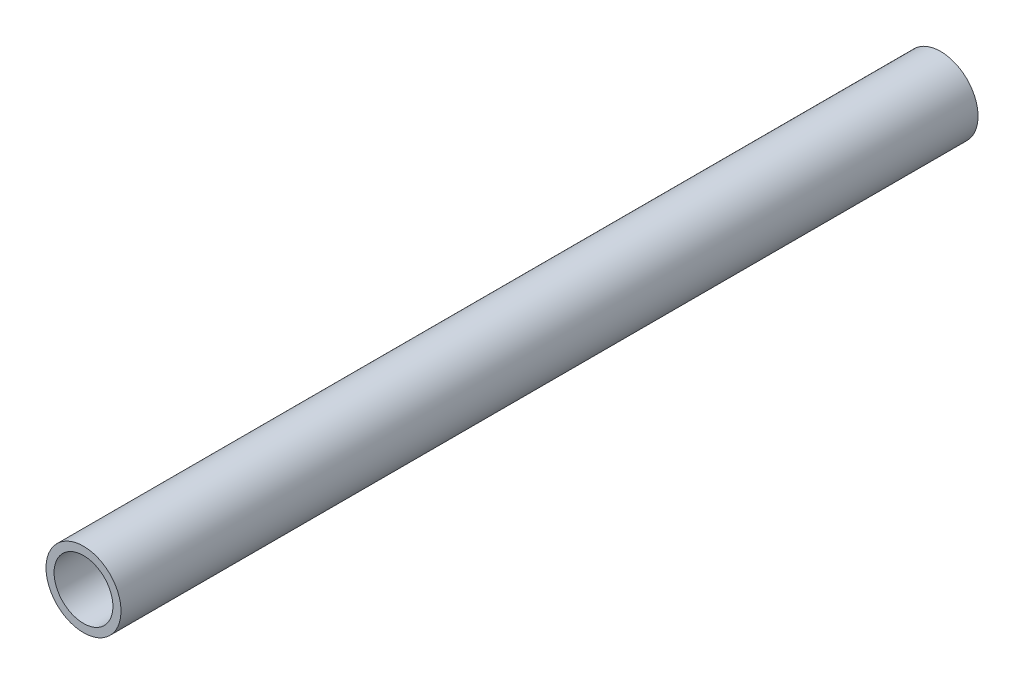
ISO-10303-21;
HEADER;
FILE_DESCRIPTION(('STEP AP214'),'2;1');
FILE_NAME('part.step','',(''),(''),'','','');
FILE_SCHEMA(('AUTOMOTIVE_DESIGN { 1 0 10303 214 1 1 1 1 }'));
ENDSEC;
DATA;
#1=APPLICATION_CONTEXT('core data for automotive mechanical design processes');
#2=APPLICATION_PROTOCOL_DEFINITION('international standard','automotive_design',2000,#1);
#3=PRODUCT_CONTEXT('',#1,'mechanical');
#4=PRODUCT('Part','Part','',(#3));
#5=PRODUCT_RELATED_PRODUCT_CATEGORY('part','',(#4));
#6=PRODUCT_DEFINITION_FORMATION('','',#4);
#7=PRODUCT_DEFINITION_CONTEXT('part definition',#1,'design');
#8=PRODUCT_DEFINITION('design','',#6,#7);
#9=PRODUCT_DEFINITION_SHAPE('','',#8);
#10=(LENGTH_UNIT() NAMED_UNIT(*) SI_UNIT(.MILLI.,.METRE.));
#11=(NAMED_UNIT(*) PLANE_ANGLE_UNIT() SI_UNIT($,.RADIAN.));
#12=(NAMED_UNIT(*) SI_UNIT($,.STERADIAN.) SOLID_ANGLE_UNIT());
#13=UNCERTAINTY_MEASURE_WITH_UNIT(LENGTH_MEASURE(1.E-05),#10,'distance_accuracy_value','');
#14=(GEOMETRIC_REPRESENTATION_CONTEXT(3) GLOBAL_UNCERTAINTY_ASSIGNED_CONTEXT((#13)) GLOBAL_UNIT_ASSIGNED_CONTEXT((#10,
#11,#12)) REPRESENTATION_CONTEXT('',''));
#15=CARTESIAN_POINT('',(0.,0.,0.));
#16=DIRECTION('',(0.,0.,1.));
#17=DIRECTION('',(1.,0.,0.));
#18=AXIS2_PLACEMENT_3D('',#15,#16,#17);
#19=CARTESIAN_POINT('',(0.,0.,304.8));
#20=DIRECTION('',(0.,0.,1.));
#21=DIRECTION('',(1.,0.,0.));
#22=AXIS2_PLACEMENT_3D('',#19,#20,#21);
#23=PLANE('',#22);
#24=CARTESIAN_POINT('',(0.,0.,304.8));
#25=DIRECTION('',(0.,0.,1.));
#26=DIRECTION('',(1.,0.,0.));
#27=AXIS2_PLACEMENT_3D('',#24,#25,#26);
#28=CIRCLE('',#27,13.335);
#29=CARTESIAN_POINT('',(-13.335,0.,304.8));
#30=VERTEX_POINT('',#29);
#31=EDGE_CURVE('E10',#30,#30,#28,.T.);
#32=ORIENTED_EDGE('',*,*,#31,.T.);
#33=EDGE_LOOP('',(#32));
#34=FACE_BOUND('',#33,.T.);
#35=CARTESIAN_POINT('',(0.,0.,304.8));
#36=DIRECTION('',(0.,0.,1.));
#37=DIRECTION('',(1.,0.,0.));
#38=AXIS2_PLACEMENT_3D('',#35,#36,#37);
#39=CIRCLE('',#38,10.4648);
#40=CARTESIAN_POINT('',(-10.4648,0.,304.8));
#41=VERTEX_POINT('',#40);
#42=EDGE_CURVE('E46',#41,#41,#39,.T.);
#43=ORIENTED_EDGE('',*,*,#42,.F.);
#44=EDGE_LOOP('',(#43));
#45=FACE_BOUND('',#44,.T.);
#46=ADVANCED_FACE('F35',(#34,#45),#23,.T.);
#47=CARTESIAN_POINT('',(0.,0.,0.));
#48=DIRECTION('',(0.,0.,1.));
#49=DIRECTION('',(1.,0.,0.));
#50=AXIS2_PLACEMENT_3D('',#47,#48,#49);
#51=PLANE('',#50);
#52=CARTESIAN_POINT('',(0.,0.,0.));
#53=DIRECTION('',(0.,0.,1.));
#54=DIRECTION('',(1.,0.,0.));
#55=AXIS2_PLACEMENT_3D('',#52,#53,#54);
#56=CIRCLE('',#55,13.335);
#57=CARTESIAN_POINT('',(-13.335,0.,0.));
#58=VERTEX_POINT('',#57);
#59=EDGE_CURVE('E39',#58,#58,#56,.T.);
#60=ORIENTED_EDGE('',*,*,#59,.F.);
#61=EDGE_LOOP('',(#60));
#62=FACE_BOUND('',#61,.T.);
#63=CARTESIAN_POINT('',(0.,0.,0.));
#64=DIRECTION('',(0.,0.,1.));
#65=DIRECTION('',(1.,0.,0.));
#66=AXIS2_PLACEMENT_3D('',#63,#64,#65);
#67=CIRCLE('',#66,10.4648);
#68=CARTESIAN_POINT('',(-10.4648,0.,0.));
#69=VERTEX_POINT('',#68);
#70=EDGE_CURVE('E48',#69,#69,#67,.T.);
#71=ORIENTED_EDGE('',*,*,#70,.T.);
#72=EDGE_LOOP('',(#71));
#73=FACE_BOUND('',#72,.T.);
#74=ADVANCED_FACE('F58',(#62,#73),#51,.F.);
#75=CARTESIAN_POINT('',(0.,0.,304.8));
#76=DIRECTION('',(0.,0.,-1.));
#77=DIRECTION('',(-1.,0.,0.));
#78=AXIS2_PLACEMENT_3D('',#75,#76,#77);
#79=CYLINDRICAL_SURFACE('',#78,13.335);
#80=CARTESIAN_POINT('',(-13.335,0.,304.8));
#81=CARTESIAN_POINT('',(-13.335,0.,301.625));
#82=CARTESIAN_POINT('',(-13.335,0.,298.45));
#83=CARTESIAN_POINT('',(-13.335,0.,292.1));
#84=CARTESIAN_POINT('',(-13.335,0.,288.925));
#85=CARTESIAN_POINT('',(-13.335,0.,282.575));
#86=CARTESIAN_POINT('',(-13.335,0.,279.4));
#87=CARTESIAN_POINT('',(-13.335,0.,273.05));
#88=CARTESIAN_POINT('',(-13.335,0.,269.875));
#89=CARTESIAN_POINT('',(-13.335,0.,263.525));
#90=CARTESIAN_POINT('',(-13.335,0.,260.35));
#91=CARTESIAN_POINT('',(-13.335,0.,254.));
#92=CARTESIAN_POINT('',(-13.335,0.,250.825));
#93=CARTESIAN_POINT('',(-13.335,0.,244.475));
#94=CARTESIAN_POINT('',(-13.335,0.,241.3));
#95=CARTESIAN_POINT('',(-13.335,0.,234.95));
#96=CARTESIAN_POINT('',(-13.335,0.,231.775));
#97=CARTESIAN_POINT('',(-13.335,0.,225.425));
#98=CARTESIAN_POINT('',(-13.335,0.,222.25));
#99=CARTESIAN_POINT('',(-13.335,0.,215.9));
#100=CARTESIAN_POINT('',(-13.335,0.,212.725));
#101=CARTESIAN_POINT('',(-13.335,0.,206.375));
#102=CARTESIAN_POINT('',(-13.335,0.,203.2));
#103=CARTESIAN_POINT('',(-13.335,0.,196.85));
#104=CARTESIAN_POINT('',(-13.335,0.,193.675));
#105=CARTESIAN_POINT('',(-13.335,0.,187.325));
#106=CARTESIAN_POINT('',(-13.335,0.,184.15));
#107=CARTESIAN_POINT('',(-13.335,0.,177.8));
#108=CARTESIAN_POINT('',(-13.335,0.,174.625));
#109=CARTESIAN_POINT('',(-13.335,0.,168.275));
#110=CARTESIAN_POINT('',(-13.335,0.,165.1));
#111=CARTESIAN_POINT('',(-13.335,0.,158.75));
#112=CARTESIAN_POINT('',(-13.335,0.,155.575));
#113=CARTESIAN_POINT('',(-13.335,0.,149.225));
#114=CARTESIAN_POINT('',(-13.335,0.,146.05));
#115=CARTESIAN_POINT('',(-13.335,0.,139.7));
#116=CARTESIAN_POINT('',(-13.335,0.,136.525));
#117=CARTESIAN_POINT('',(-13.335,0.,130.175));
#118=CARTESIAN_POINT('',(-13.335,0.,127.));
#119=CARTESIAN_POINT('',(-13.335,0.,120.65));
#120=CARTESIAN_POINT('',(-13.335,0.,117.475));
#121=CARTESIAN_POINT('',(-13.335,0.,111.125));
#122=CARTESIAN_POINT('',(-13.335,0.,107.95));
#123=CARTESIAN_POINT('',(-13.335,0.,101.6));
#124=CARTESIAN_POINT('',(-13.335,0.,98.425));
#125=CARTESIAN_POINT('',(-13.335,0.,92.075));
#126=CARTESIAN_POINT('',(-13.335,0.,88.9));
#127=CARTESIAN_POINT('',(-13.335,0.,82.55));
#128=CARTESIAN_POINT('',(-13.335,0.,79.375));
#129=CARTESIAN_POINT('',(-13.335,0.,73.025));
#130=CARTESIAN_POINT('',(-13.335,0.,69.85));
#131=CARTESIAN_POINT('',(-13.335,0.,63.5));
#132=CARTESIAN_POINT('',(-13.335,0.,60.325));
#133=CARTESIAN_POINT('',(-13.335,0.,53.975));
#134=CARTESIAN_POINT('',(-13.335,0.,50.8));
#135=CARTESIAN_POINT('',(-13.335,0.,44.45));
#136=CARTESIAN_POINT('',(-13.335,0.,41.275));
#137=CARTESIAN_POINT('',(-13.335,0.,34.925));
#138=CARTESIAN_POINT('',(-13.335,0.,31.75));
#139=CARTESIAN_POINT('',(-13.335,0.,25.4));
#140=CARTESIAN_POINT('',(-13.335,0.,22.225));
#141=CARTESIAN_POINT('',(-13.335,0.,15.875));
#142=CARTESIAN_POINT('',(-13.335,0.,12.7));
#143=CARTESIAN_POINT('',(-13.335,0.,6.35));
#144=CARTESIAN_POINT('',(-13.335,0.,3.175));
#145=CARTESIAN_POINT('',(-13.335,0.,0.));
#146=B_SPLINE_CURVE_WITH_KNOTS('',3,(#80,#81,#82,#83,#84,#85,#86,#87,#88,#89,#90,#91,#92,#93,
#94,#95,#96,#97,#98,#99,#100,#101,#102,#103,#104,#105,#106,#107,#108,#109,#110,#111,#112,#113,
#114,#115,#116,#117,#118,#119,#120,#121,#122,#123,#124,#125,#126,#127,#128,#129,#130,#131,#132,
#133,#134,#135,#136,#137,#138,#139,#140,#141,#142,#143,#144,#145),.UNSPECIFIED.,.F.,.F.,(4,2,2,
2,2,2,2,2,2,2,2,2,2,2,2,2,2,2,2,2,2,2,2,2,2,2,2,2,2,2,2,2,4),(0.,9.52499999999995,19.05,28.575,
38.1,47.625,57.15,66.675,76.2,85.725,95.2499999999999,104.775,114.3,123.825,133.35,142.875,
152.4,161.925,171.45,180.975,190.5,200.025,209.55,219.075,228.6,238.125,247.65,257.175,266.7,
276.225,285.75,295.275,304.8),.UNSPECIFIED.);
#147=EDGE_CURVE('BSEAM37',#30,#58,#146,.T.);
#148=ORIENTED_EDGE('',*,*,#31,.F.);
#149=ORIENTED_EDGE('',*,*,#59,.T.);
#150=ORIENTED_EDGE('',*,*,#147,.T.);
#151=ORIENTED_EDGE('',*,*,#147,.F.);
#152=EDGE_LOOP('',(#148,#150,#149,#151));
#153=FACE_BOUND('',#152,.T.);
#154=ADVANCED_FACE('F37',(#153),#79,.T.);
#155=CARTESIAN_POINT('',(0.,0.,304.8));
#156=DIRECTION('',(0.,0.,-1.));
#157=DIRECTION('',(-1.,0.,0.));
#158=AXIS2_PLACEMENT_3D('',#155,#156,#157);
#159=CYLINDRICAL_SURFACE('',#158,10.4648);
#160=CARTESIAN_POINT('',(-10.4648,0.,304.8));
#161=CARTESIAN_POINT('',(-10.4648,0.,301.625));
#162=CARTESIAN_POINT('',(-10.4648,0.,298.45));
#163=CARTESIAN_POINT('',(-10.4648,0.,292.1));
#164=CARTESIAN_POINT('',(-10.4648,0.,288.925));
#165=CARTESIAN_POINT('',(-10.4648,0.,282.575));
#166=CARTESIAN_POINT('',(-10.4648,0.,279.4));
#167=CARTESIAN_POINT('',(-10.4648,0.,273.05));
#168=CARTESIAN_POINT('',(-10.4648,0.,269.875));
#169=CARTESIAN_POINT('',(-10.4648,0.,263.525));
#170=CARTESIAN_POINT('',(-10.4648,0.,260.35));
#171=CARTESIAN_POINT('',(-10.4648,0.,254.));
#172=CARTESIAN_POINT('',(-10.4648,0.,250.825));
#173=CARTESIAN_POINT('',(-10.4648,0.,244.475));
#174=CARTESIAN_POINT('',(-10.4648,0.,241.3));
#175=CARTESIAN_POINT('',(-10.4648,0.,234.95));
#176=CARTESIAN_POINT('',(-10.4648,0.,231.775));
#177=CARTESIAN_POINT('',(-10.4648,0.,225.425));
#178=CARTESIAN_POINT('',(-10.4648,0.,222.25));
#179=CARTESIAN_POINT('',(-10.4648,0.,215.9));
#180=CARTESIAN_POINT('',(-10.4648,0.,212.725));
#181=CARTESIAN_POINT('',(-10.4648,0.,206.375));
#182=CARTESIAN_POINT('',(-10.4648,0.,203.2));
#183=CARTESIAN_POINT('',(-10.4648,0.,196.85));
#184=CARTESIAN_POINT('',(-10.4648,0.,193.675));
#185=CARTESIAN_POINT('',(-10.4648,0.,187.325));
#186=CARTESIAN_POINT('',(-10.4648,0.,184.15));
#187=CARTESIAN_POINT('',(-10.4648,0.,177.8));
#188=CARTESIAN_POINT('',(-10.4648,0.,174.625));
#189=CARTESIAN_POINT('',(-10.4648,0.,168.275));
#190=CARTESIAN_POINT('',(-10.4648,0.,165.1));
#191=CARTESIAN_POINT('',(-10.4648,0.,158.75));
#192=CARTESIAN_POINT('',(-10.4648,0.,155.575));
#193=CARTESIAN_POINT('',(-10.4648,0.,149.225));
#194=CARTESIAN_POINT('',(-10.4648,0.,146.05));
#195=CARTESIAN_POINT('',(-10.4648,0.,139.7));
#196=CARTESIAN_POINT('',(-10.4648,0.,136.525));
#197=CARTESIAN_POINT('',(-10.4648,0.,130.175));
#198=CARTESIAN_POINT('',(-10.4648,0.,127.));
#199=CARTESIAN_POINT('',(-10.4648,0.,120.65));
#200=CARTESIAN_POINT('',(-10.4648,0.,117.475));
#201=CARTESIAN_POINT('',(-10.4648,0.,111.125));
#202=CARTESIAN_POINT('',(-10.4648,0.,107.95));
#203=CARTESIAN_POINT('',(-10.4648,0.,101.6));
#204=CARTESIAN_POINT('',(-10.4648,0.,98.425));
#205=CARTESIAN_POINT('',(-10.4648,0.,92.075));
#206=CARTESIAN_POINT('',(-10.4648,0.,88.9));
#207=CARTESIAN_POINT('',(-10.4648,0.,82.55));
#208=CARTESIAN_POINT('',(-10.4648,0.,79.375));
#209=CARTESIAN_POINT('',(-10.4648,0.,73.025));
#210=CARTESIAN_POINT('',(-10.4648,0.,69.85));
#211=CARTESIAN_POINT('',(-10.4648,0.,63.5));
#212=CARTESIAN_POINT('',(-10.4648,0.,60.325));
#213=CARTESIAN_POINT('',(-10.4648,0.,53.975));
#214=CARTESIAN_POINT('',(-10.4648,0.,50.8));
#215=CARTESIAN_POINT('',(-10.4648,0.,44.45));
#216=CARTESIAN_POINT('',(-10.4648,0.,41.275));
#217=CARTESIAN_POINT('',(-10.4648,0.,34.925));
#218=CARTESIAN_POINT('',(-10.4648,0.,31.75));
#219=CARTESIAN_POINT('',(-10.4648,0.,25.4));
#220=CARTESIAN_POINT('',(-10.4648,0.,22.225));
#221=CARTESIAN_POINT('',(-10.4648,0.,15.875));
#222=CARTESIAN_POINT('',(-10.4648,0.,12.7));
#223=CARTESIAN_POINT('',(-10.4648,0.,6.35));
#224=CARTESIAN_POINT('',(-10.4648,0.,3.175));
#225=CARTESIAN_POINT('',(-10.4648,0.,0.));
#226=B_SPLINE_CURVE_WITH_KNOTS('',3,(#160,#161,#162,#163,#164,#165,#166,#167,#168,#169,#170,
#171,#172,#173,#174,#175,#176,#177,#178,#179,#180,#181,#182,#183,#184,#185,#186,#187,#188,#189,
#190,#191,#192,#193,#194,#195,#196,#197,#198,#199,#200,#201,#202,#203,#204,#205,#206,#207,#208,
#209,#210,#211,#212,#213,#214,#215,#216,#217,#218,#219,#220,#221,#222,#223,#224,#225),
.UNSPECIFIED.,.F.,.F.,(4,2,2,2,2,2,2,2,2,2,2,2,2,2,2,2,2,2,2,2,2,2,2,2,2,2,2,2,2,2,2,2,4),(0.,
9.52499999999995,19.05,28.575,38.1,47.625,57.15,66.675,76.2,85.725,95.2499999999999,104.775,
114.3,123.825,133.35,142.875,152.4,161.925,171.45,180.975,190.5,200.025,209.55,219.075,228.6,
238.125,247.65,257.175,266.7,276.225,285.75,295.275,304.8),.UNSPECIFIED.);
#227=EDGE_CURVE('BSEAM54',#41,#69,#226,.T.);
#228=ORIENTED_EDGE('',*,*,#42,.T.);
#229=ORIENTED_EDGE('',*,*,#70,.F.);
#230=ORIENTED_EDGE('',*,*,#227,.T.);
#231=ORIENTED_EDGE('',*,*,#227,.F.);
#232=EDGE_LOOP('',(#228,#230,#229,#231));
#233=FACE_BOUND('',#232,.T.);
#234=ADVANCED_FACE('F54',(#233),#159,.F.);
#235=CLOSED_SHELL('',(#46,#74,#154,#234));
#236=MANIFOLD_SOLID_BREP('B2',#235);
#237=ADVANCED_BREP_SHAPE_REPRESENTATION('',(#18,#236),#14);
#238=SHAPE_DEFINITION_REPRESENTATION(#9,#237);
ENDSEC;
END-ISO-10303-21;
